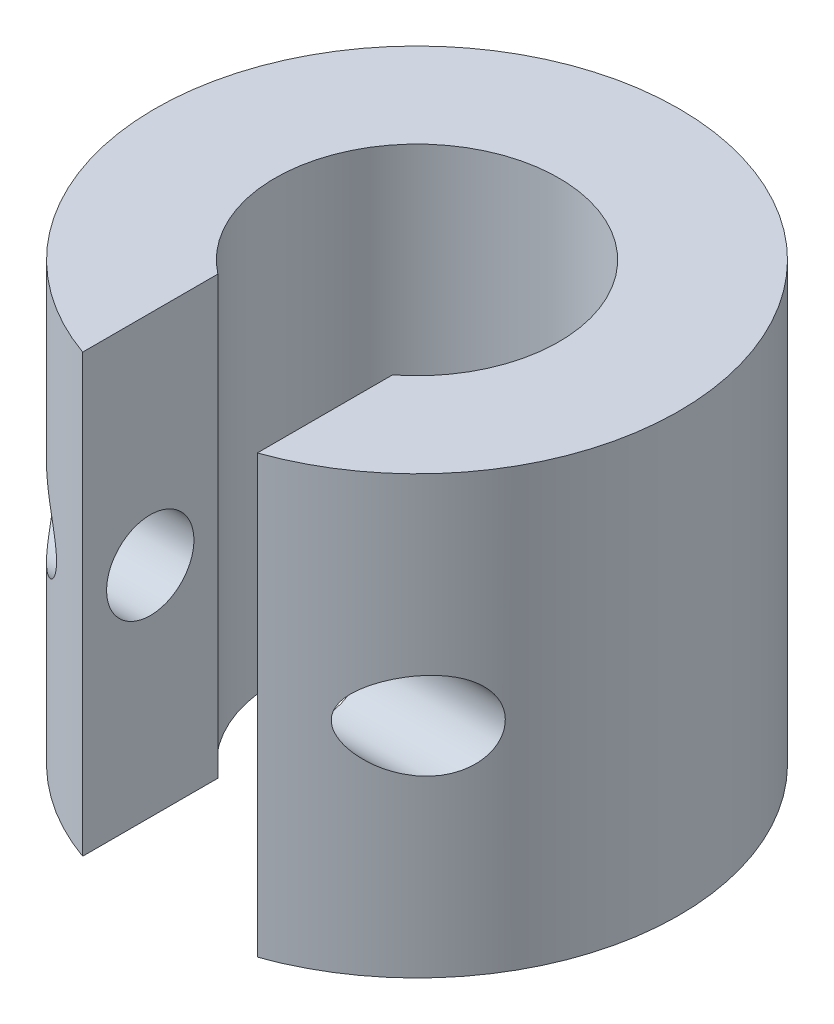
ISO-10303-21;
HEADER;
FILE_DESCRIPTION(('STEP AP214'),'2;1');
FILE_NAME('part.step','',(''),(''),'','','');
FILE_SCHEMA(('AUTOMOTIVE_DESIGN { 1 0 10303 214 1 1 1 1 }'));
ENDSEC;
DATA;
#1=APPLICATION_CONTEXT('core data for automotive mechanical design processes');
#2=APPLICATION_PROTOCOL_DEFINITION('international standard','automotive_design',2000,#1);
#3=PRODUCT_CONTEXT('',#1,'mechanical');
#4=PRODUCT('Part','Part','',(#3));
#5=PRODUCT_RELATED_PRODUCT_CATEGORY('part','',(#4));
#6=PRODUCT_DEFINITION_FORMATION('','',#4);
#7=PRODUCT_DEFINITION_CONTEXT('part definition',#1,'design');
#8=PRODUCT_DEFINITION('design','',#6,#7);
#9=PRODUCT_DEFINITION_SHAPE('','',#8);
#10=(LENGTH_UNIT() NAMED_UNIT(*) SI_UNIT(.MILLI.,.METRE.));
#11=(NAMED_UNIT(*) PLANE_ANGLE_UNIT() SI_UNIT($,.RADIAN.));
#12=(NAMED_UNIT(*) SI_UNIT($,.STERADIAN.) SOLID_ANGLE_UNIT());
#13=UNCERTAINTY_MEASURE_WITH_UNIT(LENGTH_MEASURE(1.E-05),#10,'distance_accuracy_value','');
#14=(GEOMETRIC_REPRESENTATION_CONTEXT(3) GLOBAL_UNCERTAINTY_ASSIGNED_CONTEXT((#13)) GLOBAL_UNIT_ASSIGNED_CONTEXT((#10,
#11,#12)) REPRESENTATION_CONTEXT('',''));
#15=CARTESIAN_POINT('',(0.,0.,0.));
#16=DIRECTION('',(0.,0.,1.));
#17=DIRECTION('',(1.,0.,0.));
#18=AXIS2_PLACEMENT_3D('',#15,#16,#17);
#19=CARTESIAN_POINT('',(-3.8620082019736,10.,-7.88835717849927));
#20=DIRECTION('',(0.,-1.,0.));
#21=DIRECTION('',(0.,0.,-1.));
#22=AXIS2_PLACEMENT_3D('',#19,#20,#21);
#23=CYLINDRICAL_SURFACE('',#22,6.);
#24=CARTESIAN_POINT('',(-3.8620082019736,0.,-7.88835717849927));
#25=DIRECTION('',(0.,1.,0.));
#26=DIRECTION('',(0.,0.,1.));
#27=AXIS2_PLACEMENT_3D('',#24,#25,#26);
#28=CIRCLE('',#27,6.);
#29=CARTESIAN_POINT('',(-1.8620082019736,0.,-2.23150292900689));
#30=VERTEX_POINT('',#29);
#31=CARTESIAN_POINT('',(-5.8620082019736,0.,-2.23150292900689));
#32=VERTEX_POINT('',#31);
#33=EDGE_CURVE('E91',#30,#32,#28,.T.);
#34=ORIENTED_EDGE('',*,*,#33,.T.);
#35=DIRECTION('',(0.,-1.,0.));
#36=VECTOR('',#35,1.);
#37=CARTESIAN_POINT('',(-5.8620082019736,10.,-2.23150292900689));
#38=LINE('',#37,#36);
#39=CARTESIAN_POINT('',(-5.8620082019736,10.,-2.23150292900689));
#40=VERTEX_POINT('',#39);
#41=EDGE_CURVE('E45',#40,#32,#38,.T.);
#42=ORIENTED_EDGE('',*,*,#41,.F.);
#43=CARTESIAN_POINT('',(-3.8620082019736,10.,-7.88835717849927));
#44=DIRECTION('',(0.,1.,0.));
#45=DIRECTION('',(0.,0.,1.));
#46=AXIS2_PLACEMENT_3D('',#43,#44,#45);
#47=CIRCLE('',#46,6.);
#48=CARTESIAN_POINT('',(-1.8620082019736,10.,-2.23150292900689));
#49=VERTEX_POINT('',#48);
#50=EDGE_CURVE('E79',#49,#40,#47,.T.);
#51=ORIENTED_EDGE('',*,*,#50,.F.);
#52=DIRECTION('',(0.,-1.,0.));
#53=VECTOR('',#52,1.);
#54=CARTESIAN_POINT('',(-1.8620082019736,10.,-2.23150292900689));
#55=LINE('',#54,#53);
#56=EDGE_CURVE('E11',#49,#30,#55,.T.);
#57=ORIENTED_EDGE('',*,*,#56,.T.);
#58=EDGE_LOOP('',(#34,#42,#51,#57));
#59=FACE_BOUND('',#58,.T.);
#60=CARTESIAN_POINT('',(-7.00765514432473,5.,-2.77906120800813));
#61=CARTESIAN_POINT('',(-7.00765630914736,5.0318743013244,-2.77906183937378));
#62=CARTESIAN_POINT('',(-7.01015849065777,5.06375306769962,-2.78059992925814));
#63=CARTESIAN_POINT('',(-7.01986054556254,5.12650780370975,-2.78659285239269));
#64=CARTESIAN_POINT('',(-7.02706579994374,5.15738258210804,-2.79105102665666));
#65=CARTESIAN_POINT('',(-7.04781596809454,5.22519540868103,-2.80398784319285));
#66=CARTESIAN_POINT('',(-7.06252000507736,5.26163087559104,-2.81320904757354));
#67=CARTESIAN_POINT('',(-7.09652641321701,5.33126053644953,-2.83481394681771));
#68=CARTESIAN_POINT('',(-7.11583867121538,5.3644475419841,-2.84720444550544));
#69=CARTESIAN_POINT('',(-7.17005812948466,5.44635175716463,-2.8825237072773));
#70=CARTESIAN_POINT('',(-7.20742089921839,5.4926046310645,-2.90734393186306));
#71=CARTESIAN_POINT('',(-7.28666198050626,5.57804304685892,-2.96148467575776));
#72=CARTESIAN_POINT('',(-7.32855208156133,5.61720939032998,-2.99081703326476));
#73=CARTESIAN_POINT('',(-7.40691353644429,5.68269730391812,-3.04733099733076));
#74=CARTESIAN_POINT('',(-7.44296227919413,5.71005607169244,-3.07391403008564));
#75=CARTESIAN_POINT('',(-7.51611620393044,5.76097917713497,-3.12919720586288));
#76=CARTESIAN_POINT('',(-7.55322199247831,5.78454128237401,-3.15789858010981));
#77=CARTESIAN_POINT('',(-7.6654445440129,5.84985574881343,-3.24691825021323));
#78=CARTESIAN_POINT('',(-7.74145530413466,5.88622731851226,-3.31014412342217));
#79=CARTESIAN_POINT('',(-7.89581413254837,5.94570319578003,-3.44545938075709));
#80=CARTESIAN_POINT('',(-7.97415146232952,5.96830162273904,-3.5177806834156));
#81=CARTESIAN_POINT('',(-8.12830878999003,5.99676030886373,-3.66814332180327));
#82=CARTESIAN_POINT('',(-8.20413264938497,6.00264754377477,-3.74617523013916));
#83=CARTESIAN_POINT('',(-8.33328132220312,5.99605379105273,-3.88654221382487));
#84=CARTESIAN_POINT('',(-8.38762624500942,5.98765565601091,-3.94813080845495));
#85=CARTESIAN_POINT('',(-8.49233976811703,5.95831103665118,-4.07174225546782));
#86=CARTESIAN_POINT('',(-8.54271317586478,5.93737999554469,-4.13376448072091));
#87=CARTESIAN_POINT('',(-8.62853959160414,5.8871671200104,-4.24362884487657));
#88=CARTESIAN_POINT('',(-8.66496859010058,5.8603705417363,-4.29184010053584));
#89=CARTESIAN_POINT('',(-8.73344740523957,5.7973751071237,-4.38515647507918));
#90=CARTESIAN_POINT('',(-8.7655019066579,5.76118643155189,-4.43026489078684));
#91=CARTESIAN_POINT('',(-8.81974860802754,5.68574813576553,-4.50860467512293));
#92=CARTESIAN_POINT('',(-8.8426993866147,5.64783456126393,-4.54259440000979));
#93=CARTESIAN_POINT('',(-8.88423816102562,5.56571415362753,-4.60527627245158));
#94=CARTESIAN_POINT('',(-8.90282730020146,5.52150897465473,-4.6339698079181));
#95=CARTESIAN_POINT('',(-8.93521077199522,5.42745607508924,-4.68468247260574));
#96=CARTESIAN_POINT('',(-8.94897894396977,5.37757945663476,-4.70666510552152));
#97=CARTESIAN_POINT('',(-8.97115660082193,5.27383329606294,-4.74239925298135));
#98=CARTESIAN_POINT('',(-8.9795684165004,5.21996550209994,-4.75615434755345));
#99=CARTESIAN_POINT('',(-8.99021627781192,5.11560924839936,-4.77362207655629));
#100=CARTESIAN_POINT('',(-8.99298349989573,5.06531779476679,-4.77819770238789));
#101=CARTESIAN_POINT('',(-8.99389475440293,4.96458747482452,-4.77970112027486));
#102=CARTESIAN_POINT('',(-8.99204038893078,4.91414866565122,-4.77663156258485));
#103=CARTESIAN_POINT('',(-8.98393902610499,4.8168310751093,-4.76331642033481));
#104=CARTESIAN_POINT('',(-8.97788440915138,4.76989248561882,-4.75338519251147));
#105=CARTESIAN_POINT('',(-8.96173468077903,4.67856074578948,-4.72718258347967));
#106=CARTESIAN_POINT('',(-8.95163953926068,4.63416761441567,-4.71091115504034));
#107=CARTESIAN_POINT('',(-8.92731799976347,4.54782580462641,-4.67227751229651));
#108=CARTESIAN_POINT('',(-8.91298818199161,4.50597445913549,-4.64976382025265));
#109=CARTESIAN_POINT('',(-8.88064130757575,4.42687129273477,-4.59986142229592));
#110=CARTESIAN_POINT('',(-8.86262316699846,4.38962082911509,-4.57247128358997));
#111=CARTESIAN_POINT('',(-8.82150348447771,4.31709738569915,-4.51124574674109));
#112=CARTESIAN_POINT('',(-8.79809011016614,4.28230539990583,-4.47705191073013));
#113=CARTESIAN_POINT('',(-8.74785864060772,4.21905554740277,-4.40548773298224));
#114=CARTESIAN_POINT('',(-8.72103920230978,4.19060019155412,-4.36811614014985));
#115=CARTESIAN_POINT('',(-8.66020416451485,4.13612048445089,-4.28553584338567));
#116=CARTESIAN_POINT('',(-8.62571452866201,4.11112473782443,-4.23999986016129));
#117=CARTESIAN_POINT('',(-8.55362988815357,4.06906329321144,-4.1477516334229));
#118=CARTESIAN_POINT('',(-8.51603219017751,4.05200455977714,-4.10103839463396));
#119=CARTESIAN_POINT('',(-8.41851651660066,4.01840251273128,-3.98366525567622));
#120=CARTESIAN_POINT('',(-8.3570075301845,4.00657374201549,-3.91296213795274));
#121=CARTESIAN_POINT('',(-8.23023689391426,3.99758407768275,-3.77405573399733));
#122=CARTESIAN_POINT('',(-8.1649694639165,4.00044640738253,-3.70585657743623));
#123=CARTESIAN_POINT('',(-8.0311426626307,4.01922974979098,-3.57241107713306));
#124=CARTESIAN_POINT('',(-7.96254646160137,4.03536870783371,-3.50723333337653));
#125=CARTESIAN_POINT('',(-7.82455187347365,4.07978826182986,-3.38203427011408));
#126=CARTESIAN_POINT('',(-7.7551529628836,4.10807727310012,-3.3220165591702));
#127=CARTESIAN_POINT('',(-7.61822073324245,4.17594936611488,-3.20876162678867));
#128=CARTESIAN_POINT('',(-7.55067503374245,4.21535731861287,-3.15543646747671));
#129=CARTESIAN_POINT('',(-7.45189416307497,4.2835532529569,-3.08060958214857));
#130=CARTESIAN_POINT('',(-7.41941061333421,4.30778038410245,-3.05654151702168));
#131=CARTESIAN_POINT('',(-7.35574262285868,4.35951333335523,-3.01030830005469));
#132=CARTESIAN_POINT('',(-7.32455725318123,4.38701675066067,-2.98814177504199));
#133=CARTESIAN_POINT('',(-7.26339536928804,4.44635839340709,-2.94548463207545));
#134=CARTESIAN_POINT('',(-7.23346700853109,4.47828611324365,-2.92504819506582));
#135=CARTESIAN_POINT('',(-7.17676571576576,4.54640091057075,-2.88700302999186));
#136=CARTESIAN_POINT('',(-7.14999046509323,4.58258481860366,-2.86939222058185));
#137=CARTESIAN_POINT('',(-7.10610902137483,4.65206438339299,-2.84094635210651));
#138=CARTESIAN_POINT('',(-7.08813632539607,4.68453562792914,-2.82945978815292));
#139=CARTESIAN_POINT('',(-7.05668508217284,4.75246601482639,-2.80953968333609));
#140=CARTESIAN_POINT('',(-7.04319748259396,4.78791895563236,-2.80109998994318));
#141=CARTESIAN_POINT('',(-7.02462315568274,4.85280720274655,-2.78953783744422));
#142=CARTESIAN_POINT('',(-7.0183176964254,4.88175098575787,-2.78563885768769));
#143=CARTESIAN_POINT('',(-7.00983477276939,4.94046232595917,-2.78040125663741));
#144=CARTESIAN_POINT('',(-7.00765405637356,4.97022921539816,-2.7790606183089));
#145=CARTESIAN_POINT('',(-7.00765514432473,5.,-2.77906120800813));
#146=B_SPLINE_CURVE_WITH_KNOTS('',3,(#60,#61,#62,#63,#64,#65,#66,#67,#68,#69,#70,#71,#72,#73,
#74,#75,#76,#77,#78,#79,#80,#81,#82,#83,#84,#85,#86,#87,#88,#89,#90,#91,#92,#93,#94,#95,#96,#97,
#98,#99,#100,#101,#102,#103,#104,#105,#106,#107,#108,#109,#110,#111,#112,#113,#114,#115,#116,
#117,#118,#119,#120,#121,#122,#123,#124,#125,#126,#127,#128,#129,#130,#131,#132,#133,#134,#135,
#136,#137,#138,#139,#140,#141,#142,#143,#144,#145),.UNSPECIFIED.,.T.,.F.,(4,2,2,2,2,2,2,2,2,2,2,
2,2,2,2,2,2,2,2,2,2,2,2,2,2,2,2,2,2,2,2,2,2,2,2,2,2,2,2,2,2,2,4),(0.,0.0955038174761269,
0.191117096943736,0.311512087422409,0.432167742856998,0.62439027141607,0.817126005610248,
0.974370824567853,1.13170776836949,1.44643026973012,1.77210775283112,2.09725921703893,
2.34409005545223,2.59061736977416,2.78816620491715,2.9855017906676,3.15235876902903,
3.31917195882207,3.48687680950236,3.65450863400743,3.80546234275183,3.95636372965494,
4.10077408593074,4.24518551800188,4.3934652801216,4.54178868178288,4.70348324156591,
4.86524175853242,5.05161178328729,5.23814503659543,5.51996320823702,5.80222700792817,
6.08921906281793,6.37641021425512,6.6593087988587,6.80057303912831,6.94173439309201,
7.08634477943835,7.23084815244205,7.34702287230995,7.46296167140894,7.55223320987269,
7.6414343361907),.UNSPECIFIED.);
#147=CARTESIAN_POINT('',(-7.00765514432473,5.,-2.77906120800813));
#148=VERTEX_POINT('',#147);
#149=EDGE_CURVE('E122',#148,#148,#146,.T.);
#150=ORIENTED_EDGE('',*,*,#149,.F.);
#151=EDGE_LOOP('',(#150));
#152=FACE_BOUND('',#151,.T.);
#153=CARTESIAN_POINT('',(-0.716361259622479,5.,-2.77906120800813));
#154=CARTESIAN_POINT('',(-0.716360094799849,4.9681256986756,-2.77906183937378));
#155=CARTESIAN_POINT('',(-0.713857913289441,4.93624693230038,-2.78059992925814));
#156=CARTESIAN_POINT('',(-0.704155858384673,4.87349219629025,-2.78659285239269));
#157=CARTESIAN_POINT('',(-0.696950604003475,4.84261741789196,-2.79105102665666));
#158=CARTESIAN_POINT('',(-0.676200435852673,4.77480459131896,-2.80398784319285));
#159=CARTESIAN_POINT('',(-0.661496398869854,4.73836912440896,-2.81320904757354));
#160=CARTESIAN_POINT('',(-0.627489990730196,4.66873946355047,-2.83481394681771));
#161=CARTESIAN_POINT('',(-0.608177732731827,4.6355524580159,-2.84720444550544));
#162=CARTESIAN_POINT('',(-0.553958274462548,4.55364824283537,-2.8825237072773));
#163=CARTESIAN_POINT('',(-0.516595504728817,4.5073953689355,-2.90734393186306));
#164=CARTESIAN_POINT('',(-0.437354423440945,4.42195695314108,-2.96148467575776));
#165=CARTESIAN_POINT('',(-0.395464322385875,4.38279060967002,-2.99081703326476));
#166=CARTESIAN_POINT('',(-0.317102867502924,4.31730269608188,-3.04733099733076));
#167=CARTESIAN_POINT('',(-0.28105412475308,4.28994392830756,-3.07391403008564));
#168=CARTESIAN_POINT('',(-0.20790020001677,4.23902082286504,-3.12919720586288));
#169=CARTESIAN_POINT('',(-0.170794411468899,4.21545871762599,-3.15789858010981));
#170=CARTESIAN_POINT('',(-0.0585718599343069,4.15014425118657,-3.24691825021323));
#171=CARTESIAN_POINT('',(0.0174389001874478,4.11377268148774,-3.31014412342217));
#172=CARTESIAN_POINT('',(0.17179772860116,4.05429680421997,-3.44545938075709));
#173=CARTESIAN_POINT('',(0.250135058382306,4.03169837726096,-3.5177806834156));
#174=CARTESIAN_POINT('',(0.404292386042815,4.00323969113627,-3.66814332180327));
#175=CARTESIAN_POINT('',(0.480116245437762,3.99735245622523,-3.74617523013916));
#176=CARTESIAN_POINT('',(0.609264918255914,4.00394620894727,-3.88654221382487));
#177=CARTESIAN_POINT('',(0.663609841062208,4.01234434398909,-3.94813080845495));
#178=CARTESIAN_POINT('',(0.768323364169819,4.04168896334882,-4.07174225546782));
#179=CARTESIAN_POINT('',(0.818696771917575,4.06262000445531,-4.13376448072091));
#180=CARTESIAN_POINT('',(0.904523187656934,4.1128328799896,-4.24362884487657));
#181=CARTESIAN_POINT('',(0.94095218615337,4.1396294582637,-4.29184010053584));
#182=CARTESIAN_POINT('',(1.00943100129237,4.2026248928763,-4.38515647507918));
#183=CARTESIAN_POINT('',(1.04148550271069,4.23881356844811,-4.43026489078684));
#184=CARTESIAN_POINT('',(1.09573220408033,4.31425186423447,-4.50860467512293));
#185=CARTESIAN_POINT('',(1.11868298266749,4.35216543873607,-4.54259440000979));
#186=CARTESIAN_POINT('',(1.16022175707841,4.43428584637247,-4.60527627245159));
#187=CARTESIAN_POINT('',(1.17881089625425,4.47849102534527,-4.6339698079181));
#188=CARTESIAN_POINT('',(1.21119436804801,4.57254392491077,-4.68468247260575));
#189=CARTESIAN_POINT('',(1.22496254002256,4.62242054336524,-4.70666510552152));
#190=CARTESIAN_POINT('',(1.24714019687472,4.72616670393706,-4.74239925298135));
#191=CARTESIAN_POINT('',(1.25555201255319,4.78003449790006,-4.75615434755345));
#192=CARTESIAN_POINT('',(1.26619987386471,4.88439075160064,-4.77362207655629));
#193=CARTESIAN_POINT('',(1.26896709594852,4.93468220523322,-4.77819770238789));
#194=CARTESIAN_POINT('',(1.26987835045572,5.03541252517548,-4.77970112027486));
#195=CARTESIAN_POINT('',(1.26802398498357,5.08585133434878,-4.77663156258485));
#196=CARTESIAN_POINT('',(1.25992262215779,5.1831689248907,-4.76331642033481));
#197=CARTESIAN_POINT('',(1.25386800520417,5.23010751438118,-4.75338519251147));
#198=CARTESIAN_POINT('',(1.23771827683182,5.32143925421052,-4.72718258347967));
#199=CARTESIAN_POINT('',(1.22762313531347,5.36583238558434,-4.71091115504034));
#200=CARTESIAN_POINT('',(1.20330159581626,5.45217419537359,-4.67227751229651));
#201=CARTESIAN_POINT('',(1.1889717780444,5.49402554086451,-4.64976382025264));
#202=CARTESIAN_POINT('',(1.15662490362854,5.57312870726523,-4.59986142229592));
#203=CARTESIAN_POINT('',(1.13860676305125,5.61037917088491,-4.57247128358997));
#204=CARTESIAN_POINT('',(1.0974870805305,5.68290261430086,-4.51124574674109));
#205=CARTESIAN_POINT('',(1.07407370621893,5.71769460009417,-4.47705191073013));
#206=CARTESIAN_POINT('',(1.02384223666051,5.78094445259723,-4.40548773298224));
#207=CARTESIAN_POINT('',(0.997022798362574,5.80939980844589,-4.36811614014985));
#208=CARTESIAN_POINT('',(0.936187760567645,5.86387951554911,-4.28553584338567));
#209=CARTESIAN_POINT('',(0.901698124714804,5.88887526217557,-4.23999986016129));
#210=CARTESIAN_POINT('',(0.82961348420636,5.93093670678856,-4.1477516334229));
#211=CARTESIAN_POINT('',(0.792015786230302,5.94799544022286,-4.10103839463396));
#212=CARTESIAN_POINT('',(0.694500112653448,5.98159748726872,-3.98366525567622));
#213=CARTESIAN_POINT('',(0.632991126237288,5.99342625798451,-3.91296213795274));
#214=CARTESIAN_POINT('',(0.506220489967049,6.00241592231725,-3.77405573399733));
#215=CARTESIAN_POINT('',(0.440953059969292,5.99955359261748,-3.70585657743622));
#216=CARTESIAN_POINT('',(0.307126258683495,5.98077025020902,-3.57241107713306));
#217=CARTESIAN_POINT('',(0.238530057654156,5.96463129216629,-3.50723333337653));
#218=CARTESIAN_POINT('',(0.100535469526436,5.92021173817014,-3.38203427011408));
#219=CARTESIAN_POINT('',(0.0311365589363944,5.89192272689988,-3.3220165591702));
#220=CARTESIAN_POINT('',(-0.105795670704757,5.82405063388512,-3.20876162678867));
#221=CARTESIAN_POINT('',(-0.173341370204757,5.78464268138713,-3.15543646747671));
#222=CARTESIAN_POINT('',(-0.272122240872241,5.7164467470431,-3.08060958214857));
#223=CARTESIAN_POINT('',(-0.304605790612995,5.69221961589755,-3.05654151702168));
#224=CARTESIAN_POINT('',(-0.368273781088526,5.64048666664477,-3.01030830005469));
#225=CARTESIAN_POINT('',(-0.399459150765984,5.61298324933933,-2.98814177504199));
#226=CARTESIAN_POINT('',(-0.460621034659165,5.55364160659291,-2.94548463207545));
#227=CARTESIAN_POINT('',(-0.49054939541612,5.52171388675635,-2.92504819506582));
#228=CARTESIAN_POINT('',(-0.547250688181453,5.45359908942925,-2.88700302999186));
#229=CARTESIAN_POINT('',(-0.574025938853978,5.41741518139634,-2.86939222058185));
#230=CARTESIAN_POINT('',(-0.617907382572375,5.34793561660701,-2.84094635210651));
#231=CARTESIAN_POINT('',(-0.635880078551135,5.31546437207086,-2.82945978815292));
#232=CARTESIAN_POINT('',(-0.667331321774366,5.24753398517361,-2.80953968333609));
#233=CARTESIAN_POINT('',(-0.68081892135325,5.21208104436764,-2.80109998994318));
#234=CARTESIAN_POINT('',(-0.699393248264466,5.14719279725345,-2.78953783744422));
#235=CARTESIAN_POINT('',(-0.705698707521806,5.11824901424213,-2.78563885768769));
#236=CARTESIAN_POINT('',(-0.714181631177821,5.05953767404083,-2.78040125663741));
#237=CARTESIAN_POINT('',(-0.716362347573655,5.02977078460184,-2.7790606183089));
#238=CARTESIAN_POINT('',(-0.716361259622479,5.,-2.77906120800813));
#239=B_SPLINE_CURVE_WITH_KNOTS('',3,(#153,#154,#155,#156,#157,#158,#159,#160,#161,#162,#163,
#164,#165,#166,#167,#168,#169,#170,#171,#172,#173,#174,#175,#176,#177,#178,#179,#180,#181,#182,
#183,#184,#185,#186,#187,#188,#189,#190,#191,#192,#193,#194,#195,#196,#197,#198,#199,#200,#201,
#202,#203,#204,#205,#206,#207,#208,#209,#210,#211,#212,#213,#214,#215,#216,#217,#218,#219,#220,
#221,#222,#223,#224,#225,#226,#227,#228,#229,#230,#231,#232,#233,#234,#235,#236,#237,#238),
.UNSPECIFIED.,.T.,.F.,(4,2,2,2,2,2,2,2,2,2,2,2,2,2,2,2,2,2,2,2,2,2,2,2,2,2,2,2,2,2,2,2,2,2,2,2,
2,2,2,2,2,2,4),(0.,0.0955038174761269,0.191117096943736,0.311512087422412,0.432167742856999,
0.624390271416072,0.817126005610249,0.974370824567851,1.13170776836949,1.44643026973012,
1.77210775283112,2.09725921703893,2.34409005545223,2.59061736977416,2.78816620491715,
2.9855017906676,3.15235876902904,3.31917195882207,3.48687680950236,3.65450863400743,
3.80546234275184,3.95636372965495,4.10077408593074,4.24518551800188,4.39346528012161,
4.54178868178289,4.70348324156591,4.86524175853242,5.0516117832873,5.23814503659543,
5.51996320823702,5.80222700792817,6.08921906281793,6.37641021425512,6.6593087988587,
6.80057303912831,6.94173439309201,7.08634477943835,7.23084815244205,7.34702287230995,
7.46296167140894,7.55223320987269,7.6414343361907),.UNSPECIFIED.);
#240=CARTESIAN_POINT('',(-0.716361259622479,5.,-2.77906120800813));
#241=VERTEX_POINT('',#240);
#242=EDGE_CURVE('E115',#241,#241,#239,.T.);
#243=ORIENTED_EDGE('',*,*,#242,.F.);
#244=EDGE_LOOP('',(#243));
#245=FACE_BOUND('',#244,.T.);
#246=ADVANCED_FACE('F35',(#59,#152,#245),#23,.T.);
#247=CARTESIAN_POINT('',(-1.86200820197361,10.,0.));
#248=DIRECTION('',(-1.,0.,0.));
#249=DIRECTION('',(0.,0.,1.));
#250=AXIS2_PLACEMENT_3D('',#247,#248,#249);
#251=PLANE('',#250);
#252=CARTESIAN_POINT('',(-1.8620082019736,5.,-3.77906120800813));
#253=DIRECTION('',(-1.,0.,0.));
#254=DIRECTION('',(0.,0.,1.));
#255=AXIS2_PLACEMENT_3D('',#252,#253,#254);
#256=CIRCLE('',#255,1.);
#257=CARTESIAN_POINT('',(-1.8620082019736,5.,-2.77906120800813));
#258=VERTEX_POINT('',#257);
#259=EDGE_CURVE('E103',#258,#258,#256,.F.);
#260=ORIENTED_EDGE('',*,*,#259,.T.);
#261=EDGE_LOOP('',(#260));
#262=FACE_BOUND('',#261,.T.);
#263=DIRECTION('',(0.,0.,-1.));
#264=VECTOR('',#263,1.);
#265=CARTESIAN_POINT('',(-1.86200820197361,0.,0.));
#266=LINE('',#265,#264);
#267=CARTESIAN_POINT('',(-1.8620082019736,0.,-5.32661948700937));
#268=VERTEX_POINT('',#267);
#269=EDGE_CURVE('E101',#30,#268,#266,.T.);
#270=ORIENTED_EDGE('',*,*,#269,.F.);
#271=ORIENTED_EDGE('',*,*,#56,.F.);
#272=DIRECTION('',(0.,0.,-1.));
#273=VECTOR('',#272,1.);
#274=CARTESIAN_POINT('',(-1.86200820197361,10.,0.));
#275=LINE('',#274,#273);
#276=CARTESIAN_POINT('',(-1.8620082019736,10.,-5.32661948700937));
#277=VERTEX_POINT('',#276);
#278=EDGE_CURVE('E85',#49,#277,#275,.T.);
#279=ORIENTED_EDGE('',*,*,#278,.T.);
#280=DIRECTION('',(0.,-1.,0.));
#281=VECTOR('',#280,1.);
#282=CARTESIAN_POINT('',(-1.8620082019736,10.,-5.32661948700937));
#283=LINE('',#282,#281);
#284=EDGE_CURVE('E53',#277,#268,#283,.T.);
#285=ORIENTED_EDGE('',*,*,#284,.T.);
#286=EDGE_LOOP('',(#270,#271,#279,#285));
#287=FACE_BOUND('',#286,.T.);
#288=ADVANCED_FACE('F37',(#262,#287),#251,.T.);
#289=CARTESIAN_POINT('',(-5.8620082019736,10.,0.));
#290=DIRECTION('',(-1.,0.,0.));
#291=DIRECTION('',(0.,0.,1.));
#292=AXIS2_PLACEMENT_3D('',#289,#290,#291);
#293=PLANE('',#292);
#294=CARTESIAN_POINT('',(-5.8620082019736,5.,-3.77906120800813));
#295=DIRECTION('',(-1.,0.,0.));
#296=DIRECTION('',(0.,0.,1.));
#297=AXIS2_PLACEMENT_3D('',#294,#295,#296);
#298=CIRCLE('',#297,1.);
#299=CARTESIAN_POINT('',(-5.8620082019736,5.,-2.77906120800813));
#300=VERTEX_POINT('',#299);
#301=EDGE_CURVE('E39',#300,#300,#298,.F.);
#302=ORIENTED_EDGE('',*,*,#301,.F.);
#303=EDGE_LOOP('',(#302));
#304=FACE_BOUND('',#303,.T.);
#305=DIRECTION('',(0.,0.,-1.));
#306=VECTOR('',#305,1.);
#307=CARTESIAN_POINT('',(-5.8620082019736,0.,0.));
#308=LINE('',#307,#306);
#309=CARTESIAN_POINT('',(-5.8620082019736,0.,-5.32661948700937));
#310=VERTEX_POINT('',#309);
#311=EDGE_CURVE('E105',#32,#310,#308,.T.);
#312=ORIENTED_EDGE('',*,*,#311,.T.);
#313=DIRECTION('',(0.,-1.,0.));
#314=VECTOR('',#313,1.);
#315=CARTESIAN_POINT('',(-5.8620082019736,10.,-5.32661948700937));
#316=LINE('',#315,#314);
#317=CARTESIAN_POINT('',(-5.8620082019736,10.,-5.32661948700937));
#318=VERTEX_POINT('',#317);
#319=EDGE_CURVE('E67',#318,#310,#316,.T.);
#320=ORIENTED_EDGE('',*,*,#319,.F.);
#321=DIRECTION('',(0.,0.,-1.));
#322=VECTOR('',#321,1.);
#323=CARTESIAN_POINT('',(-5.8620082019736,10.,0.));
#324=LINE('',#323,#322);
#325=EDGE_CURVE('E84',#40,#318,#324,.T.);
#326=ORIENTED_EDGE('',*,*,#325,.F.);
#327=ORIENTED_EDGE('',*,*,#41,.T.);
#328=EDGE_LOOP('',(#312,#320,#326,#327));
#329=FACE_BOUND('',#328,.T.);
#330=ADVANCED_FACE('F95',(#304,#329),#293,.F.);
#331=CARTESIAN_POINT('',(-3.8620082019736,10.,-7.88835717849927));
#332=DIRECTION('',(0.,-1.,0.));
#333=DIRECTION('',(0.,0.,-1.));
#334=AXIS2_PLACEMENT_3D('',#331,#332,#333);
#335=CYLINDRICAL_SURFACE('',#334,3.25);
#336=CARTESIAN_POINT('',(-3.8620082019736,0.,-7.88835717849927));
#337=DIRECTION('',(0.,1.,0.));
#338=DIRECTION('',(0.,0.,1.));
#339=AXIS2_PLACEMENT_3D('',#336,#337,#338);
#340=CIRCLE('',#339,3.25);
#341=EDGE_CURVE('E107',#268,#310,#340,.T.);
#342=ORIENTED_EDGE('',*,*,#341,.F.);
#343=ORIENTED_EDGE('',*,*,#284,.F.);
#344=CARTESIAN_POINT('',(-3.8620082019736,10.,-7.88835717849927));
#345=DIRECTION('',(0.,1.,0.));
#346=DIRECTION('',(0.,0.,1.));
#347=AXIS2_PLACEMENT_3D('',#344,#345,#346);
#348=CIRCLE('',#347,3.25);
#349=EDGE_CURVE('E96',#277,#318,#348,.T.);
#350=ORIENTED_EDGE('',*,*,#349,.T.);
#351=ORIENTED_EDGE('',*,*,#319,.T.);
#352=EDGE_LOOP('',(#342,#343,#350,#351));
#353=FACE_BOUND('',#352,.T.);
#354=ADVANCED_FACE('F138',(#353),#335,.F.);
#355=CARTESIAN_POINT('',(0.,10.,0.));
#356=DIRECTION('',(0.,1.,0.));
#357=DIRECTION('',(0.,0.,1.));
#358=AXIS2_PLACEMENT_3D('',#355,#356,#357);
#359=PLANE('',#358);
#360=ORIENTED_EDGE('',*,*,#278,.F.);
#361=ORIENTED_EDGE('',*,*,#50,.T.);
#362=ORIENTED_EDGE('',*,*,#325,.T.);
#363=ORIENTED_EDGE('',*,*,#349,.F.);
#364=EDGE_LOOP('',(#360,#361,#362,#363));
#365=FACE_BOUND('',#364,.T.);
#366=ADVANCED_FACE('F81',(#365),#359,.T.);
#367=CARTESIAN_POINT('',(0.,0.,0.));
#368=DIRECTION('',(0.,1.,0.));
#369=DIRECTION('',(0.,0.,1.));
#370=AXIS2_PLACEMENT_3D('',#367,#368,#369);
#371=PLANE('',#370);
#372=ORIENTED_EDGE('',*,*,#269,.T.);
#373=ORIENTED_EDGE('',*,*,#341,.T.);
#374=ORIENTED_EDGE('',*,*,#311,.F.);
#375=ORIENTED_EDGE('',*,*,#33,.F.);
#376=EDGE_LOOP('',(#372,#373,#374,#375));
#377=FACE_BOUND('',#376,.T.);
#378=ADVANCED_FACE('F137',(#377),#371,.F.);
#379=CARTESIAN_POINT('',(4.1379917980264,5.,-3.77906120800813));
#380=DIRECTION('',(-1.,0.,0.));
#381=DIRECTION('',(0.,0.,1.));
#382=AXIS2_PLACEMENT_3D('',#379,#380,#381);
#383=CYLINDRICAL_SURFACE('',#382,1.);
#384=ORIENTED_EDGE('',*,*,#301,.T.);
#385=EDGE_LOOP('',(#384));
#386=FACE_BOUND('',#385,.T.);
#387=ORIENTED_EDGE('',*,*,#149,.T.);
#388=EDGE_LOOP('',(#387));
#389=FACE_BOUND('',#388,.T.);
#390=ADVANCED_FACE('F132',(#386,#389),#383,.F.);
#391=ORIENTED_EDGE('',*,*,#259,.F.);
#392=EDGE_LOOP('',(#391));
#393=FACE_BOUND('',#392,.T.);
#394=ORIENTED_EDGE('',*,*,#242,.T.);
#395=EDGE_LOOP('',(#394));
#396=FACE_BOUND('',#395,.T.);
#397=ADVANCED_FACE('F128',(#393,#396),#383,.F.);
#398=CLOSED_SHELL('',(#246,#288,#330,#354,#366,#378,#390,#397));
#399=MANIFOLD_SOLID_BREP('B2',#398);
#400=ADVANCED_BREP_SHAPE_REPRESENTATION('',(#18,#399),#14);
#401=SHAPE_DEFINITION_REPRESENTATION(#9,#400);
ENDSEC;
END-ISO-10303-21;
